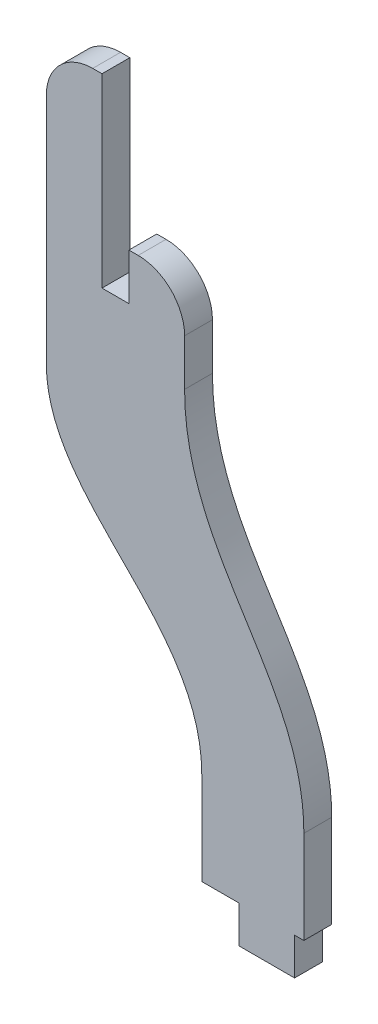
ISO-10303-21;
HEADER;
FILE_DESCRIPTION(('STEP AP214'),'2;1');
FILE_NAME('part.step','',(''),(''),'','','');
FILE_SCHEMA(('AUTOMOTIVE_DESIGN { 1 0 10303 214 1 1 1 1 }'));
ENDSEC;
DATA;
#1=APPLICATION_CONTEXT('core data for automotive mechanical design processes');
#2=APPLICATION_PROTOCOL_DEFINITION('international standard','automotive_design',2000,#1);
#3=PRODUCT_CONTEXT('',#1,'mechanical');
#4=PRODUCT('Part','Part','',(#3));
#5=PRODUCT_RELATED_PRODUCT_CATEGORY('part','',(#4));
#6=PRODUCT_DEFINITION_FORMATION('','',#4);
#7=PRODUCT_DEFINITION_CONTEXT('part definition',#1,'design');
#8=PRODUCT_DEFINITION('design','',#6,#7);
#9=PRODUCT_DEFINITION_SHAPE('','',#8);
#10=(LENGTH_UNIT() NAMED_UNIT(*) SI_UNIT(.MILLI.,.METRE.));
#11=(NAMED_UNIT(*) PLANE_ANGLE_UNIT() SI_UNIT($,.RADIAN.));
#12=(NAMED_UNIT(*) SI_UNIT($,.STERADIAN.) SOLID_ANGLE_UNIT());
#13=UNCERTAINTY_MEASURE_WITH_UNIT(LENGTH_MEASURE(1.E-05),#10,'distance_accuracy_value','');
#14=(GEOMETRIC_REPRESENTATION_CONTEXT(3) GLOBAL_UNCERTAINTY_ASSIGNED_CONTEXT((#13)) GLOBAL_UNIT_ASSIGNED_CONTEXT((#10,
#11,#12)) REPRESENTATION_CONTEXT('',''));
#15=CARTESIAN_POINT('',(0.,0.,0.));
#16=DIRECTION('',(0.,0.,1.));
#17=DIRECTION('',(1.,0.,0.));
#18=AXIS2_PLACEMENT_3D('',#15,#16,#17);
#19=CARTESIAN_POINT('',(-1.,0.,3.));
#20=DIRECTION('',(1.,0.,0.));
#21=DIRECTION('',(0.,1.,0.));
#22=AXIS2_PLACEMENT_3D('',#19,#20,#21);
#23=PLANE('',#22);
#24=DIRECTION('',(0.,-1.,0.));
#25=VECTOR('',#24,1.);
#26=CARTESIAN_POINT('',(-1.,0.,0.));
#27=LINE('',#26,#25);
#28=CARTESIAN_POINT('',(-1.,0.,0.));
#29=VERTEX_POINT('',#28);
#30=CARTESIAN_POINT('',(-1.,-4.,0.));
#31=VERTEX_POINT('',#30);
#32=EDGE_CURVE('E164',#29,#31,#27,.T.);
#33=ORIENTED_EDGE('',*,*,#32,.F.);
#34=DIRECTION('',(0.,0.,-1.));
#35=VECTOR('',#34,1.);
#36=CARTESIAN_POINT('',(-1.,0.,3.));
#37=LINE('',#36,#35);
#38=CARTESIAN_POINT('',(-1.,0.,3.));
#39=VERTEX_POINT('',#38);
#40=EDGE_CURVE('E159',#39,#29,#37,.T.);
#41=ORIENTED_EDGE('',*,*,#40,.F.);
#42=DIRECTION('',(0.,-1.,0.));
#43=VECTOR('',#42,1.);
#44=CARTESIAN_POINT('',(-1.,0.,3.));
#45=LINE('',#44,#43);
#46=CARTESIAN_POINT('',(-1.,-4.,3.));
#47=VERTEX_POINT('',#46);
#48=EDGE_CURVE('E161',#39,#47,#45,.T.);
#49=ORIENTED_EDGE('',*,*,#48,.T.);
#50=DIRECTION('',(0.,0.,-1.));
#51=VECTOR('',#50,1.);
#52=CARTESIAN_POINT('',(-1.,-4.,3.));
#53=LINE('',#52,#51);
#54=EDGE_CURVE('E207',#47,#31,#53,.T.);
#55=ORIENTED_EDGE('',*,*,#54,.T.);
#56=EDGE_LOOP('',(#33,#41,#49,#55));
#57=FACE_BOUND('',#56,.T.);
#58=ADVANCED_FACE('F34',(#57),#23,.T.);
#59=CARTESIAN_POINT('',(0.,0.,3.));
#60=DIRECTION('',(0.,-1.,0.));
#61=DIRECTION('',(1.,0.,0.));
#62=AXIS2_PLACEMENT_3D('',#59,#60,#61);
#63=PLANE('',#62);
#64=DIRECTION('',(-1.,0.,0.));
#65=VECTOR('',#64,1.);
#66=CARTESIAN_POINT('',(0.,0.,0.));
#67=LINE('',#66,#65);
#68=CARTESIAN_POINT('',(0.,0.,0.));
#69=VERTEX_POINT('',#68);
#70=EDGE_CURVE('E209',#69,#29,#67,.T.);
#71=ORIENTED_EDGE('',*,*,#70,.F.);
#72=DIRECTION('',(0.,0.,-1.));
#73=VECTOR('',#72,1.);
#74=CARTESIAN_POINT('',(0.,0.,3.));
#75=LINE('',#74,#73);
#76=CARTESIAN_POINT('',(0.,0.,3.));
#77=VERTEX_POINT('',#76);
#78=EDGE_CURVE('E170',#77,#69,#75,.T.);
#79=ORIENTED_EDGE('',*,*,#78,.F.);
#80=DIRECTION('',(-1.,0.,0.));
#81=VECTOR('',#80,1.);
#82=CARTESIAN_POINT('',(0.,0.,3.));
#83=LINE('',#82,#81);
#84=EDGE_CURVE('E175',#77,#39,#83,.T.);
#85=ORIENTED_EDGE('',*,*,#84,.T.);
#86=ORIENTED_EDGE('',*,*,#40,.T.);
#87=EDGE_LOOP('',(#71,#79,#85,#86));
#88=FACE_BOUND('',#87,.T.);
#89=ADVANCED_FACE('F180',(#88),#63,.T.);
#90=CARTESIAN_POINT('',(0.,0.,3.));
#91=DIRECTION('',(-1.,0.,0.));
#92=DIRECTION('',(0.,0.,1.));
#93=AXIS2_PLACEMENT_3D('',#90,#91,#92);
#94=PLANE('',#93);
#95=DIRECTION('',(0.,1.,0.));
#96=VECTOR('',#95,1.);
#97=CARTESIAN_POINT('',(0.,0.,0.));
#98=LINE('',#97,#96);
#99=CARTESIAN_POINT('',(0.,10.,0.));
#100=VERTEX_POINT('',#99);
#101=EDGE_CURVE('E211',#69,#100,#98,.T.);
#102=ORIENTED_EDGE('',*,*,#101,.T.);
#103=DIRECTION('',(0.,0.,-1.));
#104=VECTOR('',#103,1.);
#105=CARTESIAN_POINT('',(0.,10.,3.));
#106=LINE('',#105,#104);
#107=CARTESIAN_POINT('',(0.,10.,3.));
#108=VERTEX_POINT('',#107);
#109=EDGE_CURVE('E280',#108,#100,#106,.T.);
#110=ORIENTED_EDGE('',*,*,#109,.F.);
#111=DIRECTION('',(0.,1.,0.));
#112=VECTOR('',#111,1.);
#113=CARTESIAN_POINT('',(0.,0.,3.));
#114=LINE('',#113,#112);
#115=EDGE_CURVE('E182',#77,#108,#114,.T.);
#116=ORIENTED_EDGE('',*,*,#115,.F.);
#117=ORIENTED_EDGE('',*,*,#78,.T.);
#118=EDGE_LOOP('',(#102,#110,#116,#117));
#119=FACE_BOUND('',#118,.T.);
#120=ADVANCED_FACE('F336',(#119),#94,.F.);
#121=CARTESIAN_POINT('',(-12.85,45.,3.));
#122=CARTESIAN_POINT('',(-12.85,29.8683433735972,3.));
#123=CARTESIAN_POINT('',(0.,23.9494723118037,3.));
#124=CARTESIAN_POINT('',(0.,10.,3.));
#125=B_SPLINE_CURVE_WITH_KNOTS('',3,(#121,#122,#123,#124),.UNSPECIFIED.,.F.,.F.,(4,4),(0.,1.),.UNSPECIFIED.);
#126=DIRECTION('',(0.,0.,-1.));
#127=VECTOR('',#126,1.);
#128=SURFACE_OF_LINEAR_EXTRUSION('',#125,#127);
#129=CARTESIAN_POINT('',(-12.85,45.,0.));
#130=CARTESIAN_POINT('',(-12.85,29.8683433735972,0.));
#131=CARTESIAN_POINT('',(0.,23.9494723118037,0.));
#132=CARTESIAN_POINT('',(0.,10.,0.));
#133=B_SPLINE_CURVE_WITH_KNOTS('',3,(#129,#130,#131,#132),.UNSPECIFIED.,.F.,.F.,(4,4),(0.,1.),.UNSPECIFIED.);
#134=CARTESIAN_POINT('',(-12.85,45.,0.));
#135=VERTEX_POINT('',#134);
#136=EDGE_CURVE('E215',#135,#100,#133,.T.);
#137=ORIENTED_EDGE('',*,*,#136,.F.);
#138=DIRECTION('',(0.,0.,-1.));
#139=VECTOR('',#138,1.);
#140=CARTESIAN_POINT('',(-12.85,45.,3.));
#141=LINE('',#140,#139);
#142=CARTESIAN_POINT('',(-12.85,45.,3.));
#143=VERTEX_POINT('',#142);
#144=EDGE_CURVE('E277',#143,#135,#141,.T.);
#145=ORIENTED_EDGE('',*,*,#144,.F.);
#146=EDGE_CURVE('E185',#143,#108,#125,.T.);
#147=ORIENTED_EDGE('',*,*,#146,.T.);
#148=ORIENTED_EDGE('',*,*,#109,.T.);
#149=EDGE_LOOP('',(#137,#145,#147,#148));
#150=FACE_BOUND('',#149,.T.);
#151=ADVANCED_FACE('F331',(#150),#128,.T.);
#152=CARTESIAN_POINT('',(-12.85,0.,3.));
#153=DIRECTION('',(1.,0.,0.));
#154=DIRECTION('',(0.,1.,0.));
#155=AXIS2_PLACEMENT_3D('',#152,#153,#154);
#156=PLANE('',#155);
#157=DIRECTION('',(0.,-1.,0.));
#158=VECTOR('',#157,1.);
#159=CARTESIAN_POINT('',(-12.85,0.,0.));
#160=LINE('',#159,#158);
#161=CARTESIAN_POINT('',(-12.85,50.,0.));
#162=VERTEX_POINT('',#161);
#163=EDGE_CURVE('E220',#162,#135,#160,.T.);
#164=ORIENTED_EDGE('',*,*,#163,.F.);
#165=DIRECTION('',(0.,0.,-1.));
#166=VECTOR('',#165,1.);
#167=CARTESIAN_POINT('',(-12.85,50.,3.));
#168=LINE('',#167,#166);
#169=CARTESIAN_POINT('',(-12.85,50.,3.));
#170=VERTEX_POINT('',#169);
#171=EDGE_CURVE('E289',#162,#170,#168,.F.);
#172=ORIENTED_EDGE('',*,*,#171,.T.);
#173=DIRECTION('',(0.,-1.,0.));
#174=VECTOR('',#173,1.);
#175=CARTESIAN_POINT('',(-12.85,0.,3.));
#176=LINE('',#175,#174);
#177=EDGE_CURVE('E321',#170,#143,#176,.T.);
#178=ORIENTED_EDGE('',*,*,#177,.T.);
#179=ORIENTED_EDGE('',*,*,#144,.T.);
#180=EDGE_LOOP('',(#164,#172,#178,#179));
#181=FACE_BOUND('',#180,.T.);
#182=ADVANCED_FACE('F335',(#181),#156,.T.);
#183=CARTESIAN_POINT('',(0.,55.,3.));
#184=DIRECTION('',(0.,1.,0.));
#185=DIRECTION('',(-1.,0.,0.));
#186=AXIS2_PLACEMENT_3D('',#183,#184,#185);
#187=PLANE('',#186);
#188=DIRECTION('',(1.,0.,0.));
#189=VECTOR('',#188,1.);
#190=CARTESIAN_POINT('',(0.,55.,3.));
#191=LINE('',#190,#189);
#192=CARTESIAN_POINT('',(-18.85,55.,3.));
#193=VERTEX_POINT('',#192);
#194=CARTESIAN_POINT('',(-17.85,55.,3.));
#195=VERTEX_POINT('',#194);
#196=EDGE_CURVE('E318',#193,#195,#191,.T.);
#197=ORIENTED_EDGE('',*,*,#196,.T.);
#198=DIRECTION('',(0.,0.,-1.));
#199=VECTOR('',#198,1.);
#200=CARTESIAN_POINT('',(-17.85,55.,3.));
#201=LINE('',#200,#199);
#202=CARTESIAN_POINT('',(-17.85,55.,0.));
#203=VERTEX_POINT('',#202);
#204=EDGE_CURVE('E169',#195,#203,#201,.T.);
#205=ORIENTED_EDGE('',*,*,#204,.T.);
#206=DIRECTION('',(1.,0.,0.));
#207=VECTOR('',#206,1.);
#208=CARTESIAN_POINT('',(0.,55.,0.));
#209=LINE('',#208,#207);
#210=CARTESIAN_POINT('',(-18.85,55.,0.));
#211=VERTEX_POINT('',#210);
#212=EDGE_CURVE('E225',#211,#203,#209,.T.);
#213=ORIENTED_EDGE('',*,*,#212,.F.);
#214=DIRECTION('',(0.,0.,-1.));
#215=VECTOR('',#214,1.);
#216=CARTESIAN_POINT('',(-18.85,55.,3.));
#217=LINE('',#216,#215);
#218=EDGE_CURVE('E275',#193,#211,#217,.T.);
#219=ORIENTED_EDGE('',*,*,#218,.F.);
#220=EDGE_LOOP('',(#197,#205,#213,#219));
#221=FACE_BOUND('',#220,.T.);
#222=ADVANCED_FACE('F357',(#221),#187,.T.);
#223=CARTESIAN_POINT('',(-18.85,0.,3.));
#224=DIRECTION('',(1.,0.,0.));
#225=DIRECTION('',(0.,1.,0.));
#226=AXIS2_PLACEMENT_3D('',#223,#224,#225);
#227=PLANE('',#226);
#228=DIRECTION('',(0.,-1.,0.));
#229=VECTOR('',#228,1.);
#230=CARTESIAN_POINT('',(-18.85,0.,0.));
#231=LINE('',#230,#229);
#232=CARTESIAN_POINT('',(-18.85,50.,0.));
#233=VERTEX_POINT('',#232);
#234=EDGE_CURVE('E228',#211,#233,#231,.T.);
#235=ORIENTED_EDGE('',*,*,#234,.T.);
#236=DIRECTION('',(0.,0.,-1.));
#237=VECTOR('',#236,1.);
#238=CARTESIAN_POINT('',(-18.85,50.,3.));
#239=LINE('',#238,#237);
#240=CARTESIAN_POINT('',(-18.85,50.,3.));
#241=VERTEX_POINT('',#240);
#242=EDGE_CURVE('E272',#241,#233,#239,.T.);
#243=ORIENTED_EDGE('',*,*,#242,.F.);
#244=DIRECTION('',(0.,-1.,0.));
#245=VECTOR('',#244,1.);
#246=CARTESIAN_POINT('',(-18.85,0.,3.));
#247=LINE('',#246,#245);
#248=EDGE_CURVE('E316',#193,#241,#247,.T.);
#249=ORIENTED_EDGE('',*,*,#248,.F.);
#250=ORIENTED_EDGE('',*,*,#218,.T.);
#251=EDGE_LOOP('',(#235,#243,#249,#250));
#252=FACE_BOUND('',#251,.T.);
#253=ADVANCED_FACE('F363',(#252),#227,.F.);
#254=CARTESIAN_POINT('',(-2.39272203583008E-13,50.0000000000001,3.));
#255=DIRECTION('',(0.,-1.,0.));
#256=DIRECTION('',(1.,0.,0.));
#257=AXIS2_PLACEMENT_3D('',#254,#255,#256);
#258=PLANE('',#257);
#259=DIRECTION('',(-1.,0.,0.));
#260=VECTOR('',#259,1.);
#261=CARTESIAN_POINT('',(-2.39272203583008E-13,50.0000000000001,0.));
#262=LINE('',#261,#260);
#263=CARTESIAN_POINT('',(-21.75,50.,0.));
#264=VERTEX_POINT('',#263);
#265=EDGE_CURVE('E230',#233,#264,#262,.T.);
#266=ORIENTED_EDGE('',*,*,#265,.T.);
#267=DIRECTION('',(0.,0.,-1.));
#268=VECTOR('',#267,1.);
#269=CARTESIAN_POINT('',(-21.75,50.,3.));
#270=LINE('',#269,#268);
#271=CARTESIAN_POINT('',(-21.75,50.,3.));
#272=VERTEX_POINT('',#271);
#273=EDGE_CURVE('E269',#272,#264,#270,.T.);
#274=ORIENTED_EDGE('',*,*,#273,.F.);
#275=DIRECTION('',(-1.,0.,0.));
#276=VECTOR('',#275,1.);
#277=CARTESIAN_POINT('',(-2.39272203583008E-13,50.0000000000001,3.));
#278=LINE('',#277,#276);
#279=EDGE_CURVE('E314',#241,#272,#278,.T.);
#280=ORIENTED_EDGE('',*,*,#279,.F.);
#281=ORIENTED_EDGE('',*,*,#242,.T.);
#282=EDGE_LOOP('',(#266,#274,#280,#281));
#283=FACE_BOUND('',#282,.T.);
#284=ADVANCED_FACE('F369',(#283),#258,.F.);
#285=CARTESIAN_POINT('',(-21.75,0.,3.));
#286=DIRECTION('',(-1.,0.,0.));
#287=DIRECTION('',(0.,0.,1.));
#288=AXIS2_PLACEMENT_3D('',#285,#286,#287);
#289=PLANE('',#288);
#290=DIRECTION('',(0.,1.,0.));
#291=VECTOR('',#290,1.);
#292=CARTESIAN_POINT('',(-21.75,0.,0.));
#293=LINE('',#292,#291);
#294=CARTESIAN_POINT('',(-21.75,70.,0.));
#295=VERTEX_POINT('',#294);
#296=EDGE_CURVE('E232',#264,#295,#293,.T.);
#297=ORIENTED_EDGE('',*,*,#296,.T.);
#298=DIRECTION('',(0.,0.,-1.));
#299=VECTOR('',#298,1.);
#300=CARTESIAN_POINT('',(-21.75,70.,3.));
#301=LINE('',#300,#299);
#302=CARTESIAN_POINT('',(-21.75,70.,3.));
#303=VERTEX_POINT('',#302);
#304=EDGE_CURVE('E266',#303,#295,#301,.T.);
#305=ORIENTED_EDGE('',*,*,#304,.F.);
#306=DIRECTION('',(0.,1.,0.));
#307=VECTOR('',#306,1.);
#308=CARTESIAN_POINT('',(-21.75,0.,3.));
#309=LINE('',#308,#307);
#310=EDGE_CURVE('E310',#272,#303,#309,.T.);
#311=ORIENTED_EDGE('',*,*,#310,.F.);
#312=ORIENTED_EDGE('',*,*,#273,.T.);
#313=EDGE_LOOP('',(#297,#305,#311,#312));
#314=FACE_BOUND('',#313,.T.);
#315=ADVANCED_FACE('F373',(#314),#289,.F.);
#316=CARTESIAN_POINT('',(0.,70.,3.));
#317=DIRECTION('',(0.,-1.,0.));
#318=DIRECTION('',(0.,0.,-1.));
#319=AXIS2_PLACEMENT_3D('',#316,#317,#318);
#320=PLANE('',#319);
#321=DIRECTION('',(-1.,0.,0.));
#322=VECTOR('',#321,1.);
#323=CARTESIAN_POINT('',(0.,70.,0.));
#324=LINE('',#323,#322);
#325=CARTESIAN_POINT('',(-22.75,70.,0.));
#326=VERTEX_POINT('',#325);
#327=EDGE_CURVE('E234',#295,#326,#324,.T.);
#328=ORIENTED_EDGE('',*,*,#327,.T.);
#329=DIRECTION('',(0.,0.,-1.));
#330=VECTOR('',#329,1.);
#331=CARTESIAN_POINT('',(-22.75,70.,3.));
#332=LINE('',#331,#330);
#333=CARTESIAN_POINT('',(-22.75,70.,3.));
#334=VERTEX_POINT('',#333);
#335=EDGE_CURVE('E11',#326,#334,#332,.F.);
#336=ORIENTED_EDGE('',*,*,#335,.T.);
#337=DIRECTION('',(-1.,0.,0.));
#338=VECTOR('',#337,1.);
#339=CARTESIAN_POINT('',(0.,70.,3.));
#340=LINE('',#339,#338);
#341=EDGE_CURVE('E309',#303,#334,#340,.T.);
#342=ORIENTED_EDGE('',*,*,#341,.F.);
#343=ORIENTED_EDGE('',*,*,#304,.T.);
#344=EDGE_LOOP('',(#328,#336,#342,#343));
#345=FACE_BOUND('',#344,.T.);
#346=ADVANCED_FACE('F374',(#345),#320,.F.);
#347=CARTESIAN_POINT('',(-27.75,0.,3.));
#348=DIRECTION('',(1.,0.,0.));
#349=DIRECTION('',(0.,1.,0.));
#350=AXIS2_PLACEMENT_3D('',#347,#348,#349);
#351=PLANE('',#350);
#352=DIRECTION('',(0.,-1.,0.));
#353=VECTOR('',#352,1.);
#354=CARTESIAN_POINT('',(-27.75,0.,3.));
#355=LINE('',#354,#353);
#356=CARTESIAN_POINT('',(-27.75,65.,3.));
#357=VERTEX_POINT('',#356);
#358=CARTESIAN_POINT('',(-27.75,40.,3.));
#359=VERTEX_POINT('',#358);
#360=EDGE_CURVE('E199',#357,#359,#355,.T.);
#361=ORIENTED_EDGE('',*,*,#360,.F.);
#362=DIRECTION('',(0.,0.,-1.));
#363=VECTOR('',#362,1.);
#364=CARTESIAN_POINT('',(-27.75,65.,3.));
#365=LINE('',#364,#363);
#366=CARTESIAN_POINT('',(-27.75,65.,0.));
#367=VERTEX_POINT('',#366);
#368=EDGE_CURVE('E42',#357,#367,#365,.T.);
#369=ORIENTED_EDGE('',*,*,#368,.T.);
#370=DIRECTION('',(0.,-1.,0.));
#371=VECTOR('',#370,1.);
#372=CARTESIAN_POINT('',(-27.75,0.,0.));
#373=LINE('',#372,#371);
#374=CARTESIAN_POINT('',(-27.75,40.,0.));
#375=VERTEX_POINT('',#374);
#376=EDGE_CURVE('E236',#367,#375,#373,.T.);
#377=ORIENTED_EDGE('',*,*,#376,.T.);
#378=DIRECTION('',(0.,0.,-1.));
#379=VECTOR('',#378,1.);
#380=CARTESIAN_POINT('',(-27.75,40.,3.));
#381=LINE('',#380,#379);
#382=EDGE_CURVE('E263',#359,#375,#381,.T.);
#383=ORIENTED_EDGE('',*,*,#382,.F.);
#384=EDGE_LOOP('',(#361,#369,#377,#383));
#385=FACE_BOUND('',#384,.T.);
#386=ADVANCED_FACE('F297',(#385),#351,.F.);
#387=CARTESIAN_POINT('',(-11.,10.,3.));
#388=CARTESIAN_POINT('',(-11.,23.7563154726132,3.));
#389=CARTESIAN_POINT('',(-27.75,27.6116093772346,3.));
#390=CARTESIAN_POINT('',(-27.75,40.,3.));
#391=B_SPLINE_CURVE_WITH_KNOTS('',3,(#387,#388,#389,#390),.UNSPECIFIED.,.F.,.F.,(4,4),(0.,1.),.UNSPECIFIED.);
#392=DIRECTION('',(0.,0.,-1.));
#393=VECTOR('',#392,1.);
#394=SURFACE_OF_LINEAR_EXTRUSION('',#391,#393);
#395=CARTESIAN_POINT('',(-11.,10.,0.));
#396=CARTESIAN_POINT('',(-11.,23.7563154726132,0.));
#397=CARTESIAN_POINT('',(-27.75,27.6116093772346,0.));
#398=CARTESIAN_POINT('',(-27.75,40.,0.));
#399=B_SPLINE_CURVE_WITH_KNOTS('',3,(#395,#396,#397,#398),.UNSPECIFIED.,.F.,.F.,(4,4),(0.,1.),.UNSPECIFIED.);
#400=CARTESIAN_POINT('',(-11.,10.,0.));
#401=VERTEX_POINT('',#400);
#402=EDGE_CURVE('E238',#401,#375,#399,.T.);
#403=ORIENTED_EDGE('',*,*,#402,.F.);
#404=DIRECTION('',(0.,0.,-1.));
#405=VECTOR('',#404,1.);
#406=CARTESIAN_POINT('',(-11.,10.,3.));
#407=LINE('',#406,#405);
#408=CARTESIAN_POINT('',(-11.,10.,3.));
#409=VERTEX_POINT('',#408);
#410=EDGE_CURVE('E261',#409,#401,#407,.T.);
#411=ORIENTED_EDGE('',*,*,#410,.F.);
#412=EDGE_CURVE('E194',#409,#359,#391,.T.);
#413=ORIENTED_EDGE('',*,*,#412,.T.);
#414=ORIENTED_EDGE('',*,*,#382,.T.);
#415=EDGE_LOOP('',(#403,#411,#413,#414));
#416=FACE_BOUND('',#415,.T.);
#417=ADVANCED_FACE('F307',(#416),#394,.T.);
#418=CARTESIAN_POINT('',(-11.,0.,3.));
#419=DIRECTION('',(-1.,0.,0.));
#420=DIRECTION('',(0.,-1.,0.));
#421=AXIS2_PLACEMENT_3D('',#418,#419,#420);
#422=PLANE('',#421);
#423=DIRECTION('',(0.,1.,0.));
#424=VECTOR('',#423,1.);
#425=CARTESIAN_POINT('',(-11.,0.,0.));
#426=LINE('',#425,#424);
#427=CARTESIAN_POINT('',(-11.,0.,0.));
#428=VERTEX_POINT('',#427);
#429=EDGE_CURVE('E243',#428,#401,#426,.T.);
#430=ORIENTED_EDGE('',*,*,#429,.F.);
#431=DIRECTION('',(0.,0.,-1.));
#432=VECTOR('',#431,1.);
#433=CARTESIAN_POINT('',(-11.,0.,3.));
#434=LINE('',#433,#432);
#435=CARTESIAN_POINT('',(-11.,0.,3.));
#436=VERTEX_POINT('',#435);
#437=EDGE_CURVE('E259',#436,#428,#434,.T.);
#438=ORIENTED_EDGE('',*,*,#437,.F.);
#439=DIRECTION('',(0.,1.,0.));
#440=VECTOR('',#439,1.);
#441=CARTESIAN_POINT('',(-11.,0.,3.));
#442=LINE('',#441,#440);
#443=EDGE_CURVE('E189',#436,#409,#442,.T.);
#444=ORIENTED_EDGE('',*,*,#443,.T.);
#445=ORIENTED_EDGE('',*,*,#410,.T.);
#446=EDGE_LOOP('',(#430,#438,#444,#445));
#447=FACE_BOUND('',#446,.T.);
#448=ADVANCED_FACE('F410',(#447),#422,.T.);
#449=CARTESIAN_POINT('',(-7.,0.,0.));
#450=VERTEX_POINT('',#449);
#451=EDGE_CURVE('E212',#450,#428,#67,.T.);
#452=ORIENTED_EDGE('',*,*,#451,.F.);
#453=DIRECTION('',(0.,0.,-1.));
#454=VECTOR('',#453,1.);
#455=CARTESIAN_POINT('',(-7.,0.,3.));
#456=LINE('',#455,#454);
#457=CARTESIAN_POINT('',(-7.,0.,3.));
#458=VERTEX_POINT('',#457);
#459=EDGE_CURVE('E257',#458,#450,#456,.T.);
#460=ORIENTED_EDGE('',*,*,#459,.F.);
#461=EDGE_CURVE('E184',#458,#436,#83,.T.);
#462=ORIENTED_EDGE('',*,*,#461,.T.);
#463=ORIENTED_EDGE('',*,*,#437,.T.);
#464=EDGE_LOOP('',(#452,#460,#462,#463));
#465=FACE_BOUND('',#464,.T.);
#466=ADVANCED_FACE('F409',(#465),#63,.T.);
#467=CARTESIAN_POINT('',(-7.,0.,3.));
#468=DIRECTION('',(1.,0.,0.));
#469=DIRECTION('',(0.,0.,-1.));
#470=AXIS2_PLACEMENT_3D('',#467,#468,#469);
#471=PLANE('',#470);
#472=DIRECTION('',(0.,-1.,0.));
#473=VECTOR('',#472,1.);
#474=CARTESIAN_POINT('',(-7.,0.,0.));
#475=LINE('',#474,#473);
#476=CARTESIAN_POINT('',(-7.,-4.,0.));
#477=VERTEX_POINT('',#476);
#478=EDGE_CURVE('E249',#450,#477,#475,.T.);
#479=ORIENTED_EDGE('',*,*,#478,.T.);
#480=DIRECTION('',(0.,0.,-1.));
#481=VECTOR('',#480,1.);
#482=CARTESIAN_POINT('',(-7.,-4.,3.));
#483=LINE('',#482,#481);
#484=CARTESIAN_POINT('',(-7.,-4.,3.));
#485=VERTEX_POINT('',#484);
#486=EDGE_CURVE('E255',#485,#477,#483,.T.);
#487=ORIENTED_EDGE('',*,*,#486,.F.);
#488=DIRECTION('',(0.,-1.,0.));
#489=VECTOR('',#488,1.);
#490=CARTESIAN_POINT('',(-7.,0.,3.));
#491=LINE('',#490,#489);
#492=EDGE_CURVE('E188',#458,#485,#491,.T.);
#493=ORIENTED_EDGE('',*,*,#492,.F.);
#494=ORIENTED_EDGE('',*,*,#459,.T.);
#495=EDGE_LOOP('',(#479,#487,#493,#494));
#496=FACE_BOUND('',#495,.T.);
#497=ADVANCED_FACE('F407',(#496),#471,.F.);
#498=CARTESIAN_POINT('',(0.,-4.,3.));
#499=DIRECTION('',(0.,-1.,0.));
#500=DIRECTION('',(0.,0.,-1.));
#501=AXIS2_PLACEMENT_3D('',#498,#499,#500);
#502=PLANE('',#501);
#503=DIRECTION('',(-1.,0.,0.));
#504=VECTOR('',#503,1.);
#505=CARTESIAN_POINT('',(0.,-4.,0.));
#506=LINE('',#505,#504);
#507=EDGE_CURVE('E178',#31,#477,#506,.T.);
#508=ORIENTED_EDGE('',*,*,#507,.F.);
#509=ORIENTED_EDGE('',*,*,#54,.F.);
#510=DIRECTION('',(-1.,0.,0.));
#511=VECTOR('',#510,1.);
#512=CARTESIAN_POINT('',(0.,-4.,3.));
#513=LINE('',#512,#511);
#514=EDGE_CURVE('E177',#47,#485,#513,.T.);
#515=ORIENTED_EDGE('',*,*,#514,.T.);
#516=ORIENTED_EDGE('',*,*,#486,.T.);
#517=EDGE_LOOP('',(#508,#509,#515,#516));
#518=FACE_BOUND('',#517,.T.);
#519=ADVANCED_FACE('F403',(#518),#502,.T.);
#520=CARTESIAN_POINT('',(0.,0.,3.));
#521=DIRECTION('',(0.,0.,1.));
#522=DIRECTION('',(1.,0.,0.));
#523=AXIS2_PLACEMENT_3D('',#520,#521,#522);
#524=PLANE('',#523);
#525=ORIENTED_EDGE('',*,*,#177,.F.);
#526=CARTESIAN_POINT('',(-17.85,50.,3.));
#527=DIRECTION('',(0.,0.,1.));
#528=DIRECTION('',(1.,0.,0.));
#529=AXIS2_PLACEMENT_3D('',#526,#527,#528);
#530=CIRCLE('',#529,5.);
#531=EDGE_CURVE('E292',#170,#195,#530,.T.);
#532=ORIENTED_EDGE('',*,*,#531,.T.);
#533=ORIENTED_EDGE('',*,*,#196,.F.);
#534=ORIENTED_EDGE('',*,*,#248,.T.);
#535=ORIENTED_EDGE('',*,*,#279,.T.);
#536=ORIENTED_EDGE('',*,*,#310,.T.);
#537=ORIENTED_EDGE('',*,*,#341,.T.);
#538=CARTESIAN_POINT('',(-22.75,65.,3.));
#539=DIRECTION('',(0.,0.,1.));
#540=DIRECTION('',(1.,0.,0.));
#541=AXIS2_PLACEMENT_3D('',#538,#539,#540);
#542=CIRCLE('',#541,5.);
#543=EDGE_CURVE('E49',#334,#357,#542,.T.);
#544=ORIENTED_EDGE('',*,*,#543,.T.);
#545=ORIENTED_EDGE('',*,*,#360,.T.);
#546=ORIENTED_EDGE('',*,*,#412,.F.);
#547=ORIENTED_EDGE('',*,*,#443,.F.);
#548=ORIENTED_EDGE('',*,*,#461,.F.);
#549=ORIENTED_EDGE('',*,*,#492,.T.);
#550=ORIENTED_EDGE('',*,*,#514,.F.);
#551=ORIENTED_EDGE('',*,*,#48,.F.);
#552=ORIENTED_EDGE('',*,*,#84,.F.);
#553=ORIENTED_EDGE('',*,*,#115,.T.);
#554=ORIENTED_EDGE('',*,*,#146,.F.);
#555=EDGE_LOOP('',(#525,#532,#533,#534,#535,#536,#537,#544,#545,#546,#547,#548,#549,#550,#551,
#552,#553,#554));
#556=FACE_BOUND('',#555,.T.);
#557=ADVANCED_FACE('F174',(#556),#524,.T.);
#558=CARTESIAN_POINT('',(0.,0.,0.));
#559=DIRECTION('',(0.,0.,1.));
#560=DIRECTION('',(1.,0.,0.));
#561=AXIS2_PLACEMENT_3D('',#558,#559,#560);
#562=PLANE('',#561);
#563=ORIENTED_EDGE('',*,*,#212,.T.);
#564=CARTESIAN_POINT('',(-17.85,50.,0.));
#565=DIRECTION('',(0.,0.,1.));
#566=DIRECTION('',(1.,0.,0.));
#567=AXIS2_PLACEMENT_3D('',#564,#565,#566);
#568=CIRCLE('',#567,5.);
#569=EDGE_CURVE('E287',#203,#162,#568,.F.);
#570=ORIENTED_EDGE('',*,*,#569,.T.);
#571=ORIENTED_EDGE('',*,*,#163,.T.);
#572=ORIENTED_EDGE('',*,*,#136,.T.);
#573=ORIENTED_EDGE('',*,*,#101,.F.);
#574=ORIENTED_EDGE('',*,*,#70,.T.);
#575=ORIENTED_EDGE('',*,*,#32,.T.);
#576=ORIENTED_EDGE('',*,*,#507,.T.);
#577=ORIENTED_EDGE('',*,*,#478,.F.);
#578=ORIENTED_EDGE('',*,*,#451,.T.);
#579=ORIENTED_EDGE('',*,*,#429,.T.);
#580=ORIENTED_EDGE('',*,*,#402,.T.);
#581=ORIENTED_EDGE('',*,*,#376,.F.);
#582=CARTESIAN_POINT('',(-22.75,65.,0.));
#583=DIRECTION('',(0.,0.,1.));
#584=DIRECTION('',(1.,0.,0.));
#585=AXIS2_PLACEMENT_3D('',#582,#583,#584);
#586=CIRCLE('',#585,5.);
#587=EDGE_CURVE('E285',#367,#326,#586,.F.);
#588=ORIENTED_EDGE('',*,*,#587,.T.);
#589=ORIENTED_EDGE('',*,*,#327,.F.);
#590=ORIENTED_EDGE('',*,*,#296,.F.);
#591=ORIENTED_EDGE('',*,*,#265,.F.);
#592=ORIENTED_EDGE('',*,*,#234,.F.);
#593=EDGE_LOOP('',(#563,#570,#571,#572,#573,#574,#575,#576,#577,#578,#579,#580,#581,#588,#589,
#590,#591,#592));
#594=FACE_BOUND('',#593,.T.);
#595=ADVANCED_FACE('F301',(#594),#562,.F.);
#596=CARTESIAN_POINT('',(-17.85,50.,3.));
#597=DIRECTION('',(0.,0.,-1.));
#598=DIRECTION('',(-1.,0.,0.));
#599=AXIS2_PLACEMENT_3D('',#596,#597,#598);
#600=CYLINDRICAL_SURFACE('',#599,5.);
#601=ORIENTED_EDGE('',*,*,#531,.F.);
#602=ORIENTED_EDGE('',*,*,#171,.F.);
#603=ORIENTED_EDGE('',*,*,#569,.F.);
#604=ORIENTED_EDGE('',*,*,#204,.F.);
#605=EDGE_LOOP('',(#601,#602,#603,#604));
#606=FACE_BOUND('',#605,.T.);
#607=ADVANCED_FACE('F343',(#606),#600,.T.);
#608=CARTESIAN_POINT('',(-22.75,65.,3.));
#609=DIRECTION('',(0.,0.,-1.));
#610=DIRECTION('',(-1.,0.,0.));
#611=AXIS2_PLACEMENT_3D('',#608,#609,#610);
#612=CYLINDRICAL_SURFACE('',#611,5.);
#613=ORIENTED_EDGE('',*,*,#543,.F.);
#614=ORIENTED_EDGE('',*,*,#335,.F.);
#615=ORIENTED_EDGE('',*,*,#587,.F.);
#616=ORIENTED_EDGE('',*,*,#368,.F.);
#617=EDGE_LOOP('',(#613,#614,#615,#616));
#618=FACE_BOUND('',#617,.T.);
#619=ADVANCED_FACE('F36',(#618),#612,.T.);
#620=CLOSED_SHELL('',(#58,#89,#120,#151,#182,#222,#253,#284,#315,#346,#386,#417,#448,#466,#497,
#519,#557,#595,#607,#619));
#621=MANIFOLD_SOLID_BREP('B2',#620);
#622=ADVANCED_BREP_SHAPE_REPRESENTATION('',(#18,#621),#14);
#623=SHAPE_DEFINITION_REPRESENTATION(#9,#622);
ENDSEC;
END-ISO-10303-21;
